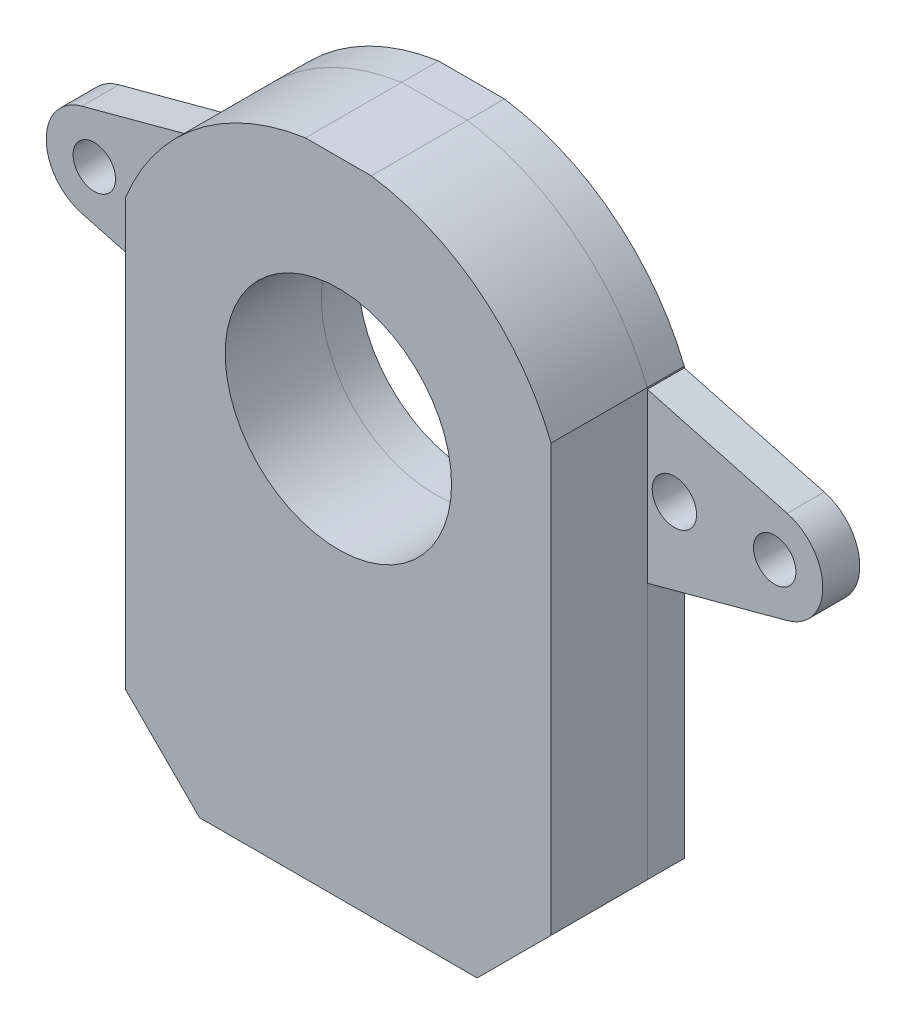
ISO-10303-21;
HEADER;
FILE_DESCRIPTION(('STEP AP214'),'2;1');
FILE_NAME('part.step','',(''),(''),'','','');
FILE_SCHEMA(('AUTOMOTIVE_DESIGN { 1 0 10303 214 1 1 1 1 }'));
ENDSEC;
DATA;
#1=APPLICATION_CONTEXT('core data for automotive mechanical design processes');
#2=APPLICATION_PROTOCOL_DEFINITION('international standard','automotive_design',2000,#1);
#3=PRODUCT_CONTEXT('',#1,'mechanical');
#4=PRODUCT('Part','Part','',(#3));
#5=PRODUCT_RELATED_PRODUCT_CATEGORY('part','',(#4));
#6=PRODUCT_DEFINITION_FORMATION('','',#4);
#7=PRODUCT_DEFINITION_CONTEXT('part definition',#1,'design');
#8=PRODUCT_DEFINITION('design','',#6,#7);
#9=PRODUCT_DEFINITION_SHAPE('','',#8);
#10=(LENGTH_UNIT() NAMED_UNIT(*) SI_UNIT(.MILLI.,.METRE.));
#11=(NAMED_UNIT(*) PLANE_ANGLE_UNIT() SI_UNIT($,.RADIAN.));
#12=(NAMED_UNIT(*) SI_UNIT($,.STERADIAN.) SOLID_ANGLE_UNIT());
#13=UNCERTAINTY_MEASURE_WITH_UNIT(LENGTH_MEASURE(1.E-05),#10,'distance_accuracy_value','');
#14=(GEOMETRIC_REPRESENTATION_CONTEXT(3) GLOBAL_UNCERTAINTY_ASSIGNED_CONTEXT((#13)) GLOBAL_UNIT_ASSIGNED_CONTEXT((#10,
#11,#12)) REPRESENTATION_CONTEXT('',''));
#15=CARTESIAN_POINT('',(0.,0.,0.));
#16=DIRECTION('',(0.,0.,1.));
#17=DIRECTION('',(1.,0.,0.));
#18=AXIS2_PLACEMENT_3D('',#15,#16,#17);
#19=CARTESIAN_POINT('',(0.,0.,9.));
#20=DIRECTION('',(0.,0.,1.));
#21=DIRECTION('',(1.,0.,0.));
#22=AXIS2_PLACEMENT_3D('',#19,#20,#21);
#23=PLANE('',#22);
#24=CARTESIAN_POINT('',(0.,0.,9.));
#25=DIRECTION('',(0.,0.,1.));
#26=DIRECTION('',(1.,0.,0.));
#27=AXIS2_PLACEMENT_3D('',#24,#25,#26);
#28=CIRCLE('',#27,7.65);
#29=CARTESIAN_POINT('',(7.65,0.,9.));
#30=VERTEX_POINT('',#29);
#31=EDGE_CURVE('E161',#30,#30,#28,.T.);
#32=ORIENTED_EDGE('',*,*,#31,.F.);
#33=EDGE_LOOP('',(#32));
#34=FACE_BOUND('',#33,.T.);
#35=DIRECTION('',(-1.,0.,0.));
#36=VECTOR('',#35,1.);
#37=CARTESIAN_POINT('',(0.,-28.04,9.));
#38=LINE('',#37,#36);
#39=CARTESIAN_POINT('',(9.38499999999999,-28.04,9.));
#40=VERTEX_POINT('',#39);
#41=CARTESIAN_POINT('',(-9.38499999999999,-28.04,9.));
#42=VERTEX_POINT('',#41);
#43=EDGE_CURVE('E148',#40,#42,#38,.T.);
#44=ORIENTED_EDGE('',*,*,#43,.F.);
#45=DIRECTION('',(-0.707106781186549,-0.707106781186546,0.));
#46=VECTOR('',#45,1.);
#47=CARTESIAN_POINT('',(18.7125,-18.7125000000001,9.));
#48=LINE('',#47,#46);
#49=CARTESIAN_POINT('',(14.385,-23.04,9.));
#50=VERTEX_POINT('',#49);
#51=EDGE_CURVE('E55',#40,#50,#48,.F.);
#52=ORIENTED_EDGE('',*,*,#51,.T.);
#53=DIRECTION('',(0.,-1.,0.));
#54=VECTOR('',#53,1.);
#55=CARTESIAN_POINT('',(14.385,0.,9.));
#56=LINE('',#55,#54);
#57=CARTESIAN_POINT('',(14.385,5.77250162407946,9.));
#58=VERTEX_POINT('',#57);
#59=EDGE_CURVE('E128',#58,#50,#56,.T.);
#60=ORIENTED_EDGE('',*,*,#59,.F.);
#61=CARTESIAN_POINT('',(0.,0.,9.));
#62=DIRECTION('',(0.,0.,1.));
#63=DIRECTION('',(1.,0.,0.));
#64=AXIS2_PLACEMENT_3D('',#61,#62,#63);
#65=CIRCLE('',#64,15.5);
#66=CARTESIAN_POINT('',(2.22135094030637,15.34,9.));
#67=VERTEX_POINT('',#66);
#68=EDGE_CURVE('E111',#58,#67,#65,.T.);
#69=ORIENTED_EDGE('',*,*,#68,.T.);
#70=DIRECTION('',(1.,0.,0.));
#71=VECTOR('',#70,1.);
#72=CARTESIAN_POINT('',(0.,15.34,9.));
#73=LINE('',#72,#71);
#74=CARTESIAN_POINT('',(-2.22135094030637,15.34,9.));
#75=VERTEX_POINT('',#74);
#76=EDGE_CURVE('E135',#75,#67,#73,.T.);
#77=ORIENTED_EDGE('',*,*,#76,.F.);
#78=CARTESIAN_POINT('',(-14.385,5.77250162407947,9.));
#79=VERTEX_POINT('',#78);
#80=EDGE_CURVE('E121',#75,#79,#65,.T.);
#81=ORIENTED_EDGE('',*,*,#80,.T.);
#82=DIRECTION('',(0.,1.,0.));
#83=VECTOR('',#82,1.);
#84=CARTESIAN_POINT('',(-14.385,0.,9.));
#85=LINE('',#84,#83);
#86=CARTESIAN_POINT('',(-14.385,-23.04,9.));
#87=VERTEX_POINT('',#86);
#88=EDGE_CURVE('E138',#87,#79,#85,.T.);
#89=ORIENTED_EDGE('',*,*,#88,.F.);
#90=DIRECTION('',(-0.707106781186546,0.707106781186549,0.));
#91=VECTOR('',#90,1.);
#92=CARTESIAN_POINT('',(-18.7125,-18.7124999999999,9.));
#93=LINE('',#92,#91);
#94=EDGE_CURVE('E67',#87,#42,#93,.F.);
#95=ORIENTED_EDGE('',*,*,#94,.T.);
#96=EDGE_LOOP('',(#44,#52,#60,#69,#77,#81,#89,#95));
#97=FACE_BOUND('',#96,.T.);
#98=ADVANCED_FACE('F47',(#34,#97),#23,.T.);
#99=CARTESIAN_POINT('',(0.,0.,2.5));
#100=DIRECTION('',(0.,0.,1.));
#101=DIRECTION('',(1.,0.,0.));
#102=AXIS2_PLACEMENT_3D('',#99,#100,#101);
#103=PLANE('',#102);
#104=CARTESIAN_POINT('',(0.,0.,2.5));
#105=DIRECTION('',(0.,0.,1.));
#106=DIRECTION('',(1.,0.,0.));
#107=AXIS2_PLACEMENT_3D('',#104,#105,#106);
#108=CIRCLE('',#107,7.65);
#109=CARTESIAN_POINT('',(7.65,0.,2.5));
#110=VERTEX_POINT('',#109);
#111=EDGE_CURVE('E158',#110,#110,#108,.F.);
#112=ORIENTED_EDGE('',*,*,#111,.F.);
#113=EDGE_LOOP('',(#112));
#114=FACE_BOUND('',#113,.T.);
#115=DIRECTION('',(0.,-1.,0.));
#116=VECTOR('',#115,1.);
#117=CARTESIAN_POINT('',(14.385,0.,2.5));
#118=LINE('',#117,#116);
#119=CARTESIAN_POINT('',(14.385,5.77250162407946,2.5));
#120=VERTEX_POINT('',#119);
#121=CARTESIAN_POINT('',(14.385,-23.04,2.5));
#122=VERTEX_POINT('',#121);
#123=EDGE_CURVE('E131',#120,#122,#118,.T.);
#124=ORIENTED_EDGE('',*,*,#123,.T.);
#125=DIRECTION('',(0.707106781186549,0.707106781186546,0.));
#126=VECTOR('',#125,1.);
#127=CARTESIAN_POINT('',(14.385,-23.04,2.5));
#128=LINE('',#127,#126);
#129=CARTESIAN_POINT('',(9.38499999999999,-28.04,2.5));
#130=VERTEX_POINT('',#129);
#131=EDGE_CURVE('E166',#122,#130,#128,.F.);
#132=ORIENTED_EDGE('',*,*,#131,.T.);
#133=DIRECTION('',(-1.,0.,0.));
#134=VECTOR('',#133,1.);
#135=CARTESIAN_POINT('',(0.,-28.04,2.5));
#136=LINE('',#135,#134);
#137=CARTESIAN_POINT('',(-9.38499999999999,-28.04,2.5));
#138=VERTEX_POINT('',#137);
#139=EDGE_CURVE('E136',#130,#138,#136,.T.);
#140=ORIENTED_EDGE('',*,*,#139,.T.);
#141=DIRECTION('',(0.707106781186546,-0.707106781186549,0.));
#142=VECTOR('',#141,1.);
#143=CARTESIAN_POINT('',(-9.38499999999999,-28.04,2.5));
#144=LINE('',#143,#142);
#145=CARTESIAN_POINT('',(-14.385,-23.04,2.5));
#146=VERTEX_POINT('',#145);
#147=EDGE_CURVE('E164',#138,#146,#144,.F.);
#148=ORIENTED_EDGE('',*,*,#147,.T.);
#149=DIRECTION('',(0.,1.,0.));
#150=VECTOR('',#149,1.);
#151=CARTESIAN_POINT('',(-14.385,0.,2.5));
#152=LINE('',#151,#150);
#153=CARTESIAN_POINT('',(-14.385,5.77250162407947,2.5));
#154=VERTEX_POINT('',#153);
#155=EDGE_CURVE('E141',#146,#154,#152,.T.);
#156=ORIENTED_EDGE('',*,*,#155,.T.);
#157=CARTESIAN_POINT('',(0.,0.,2.5));
#158=DIRECTION('',(0.,0.,1.));
#159=DIRECTION('',(1.,0.,0.));
#160=AXIS2_PLACEMENT_3D('',#157,#158,#159);
#161=CIRCLE('',#160,15.5);
#162=CARTESIAN_POINT('',(-2.22135094030637,15.34,2.5));
#163=VERTEX_POINT('',#162);
#164=EDGE_CURVE('E157',#154,#163,#161,.F.);
#165=ORIENTED_EDGE('',*,*,#164,.T.);
#166=DIRECTION('',(1.,0.,0.));
#167=VECTOR('',#166,1.);
#168=CARTESIAN_POINT('',(0.,15.34,2.5));
#169=LINE('',#168,#167);
#170=CARTESIAN_POINT('',(2.22135094030637,15.34,2.5));
#171=VERTEX_POINT('',#170);
#172=EDGE_CURVE('E152',#163,#171,#169,.T.);
#173=ORIENTED_EDGE('',*,*,#172,.T.);
#174=EDGE_CURVE('E150',#171,#120,#161,.F.);
#175=ORIENTED_EDGE('',*,*,#174,.T.);
#176=EDGE_LOOP('',(#124,#132,#140,#148,#156,#165,#173,#175));
#177=FACE_BOUND('',#176,.T.);
#178=ADVANCED_FACE('F181',(#114,#177),#103,.F.);
#179=CARTESIAN_POINT('',(14.385,0.,9.));
#180=DIRECTION('',(1.,0.,0.));
#181=DIRECTION('',(0.,1.,0.));
#182=AXIS2_PLACEMENT_3D('',#179,#180,#181);
#183=PLANE('',#182);
#184=ORIENTED_EDGE('',*,*,#59,.T.);
#185=DIRECTION('',(0.,0.,-1.));
#186=VECTOR('',#185,1.);
#187=CARTESIAN_POINT('',(14.385,-23.04,9.));
#188=LINE('',#187,#186);
#189=EDGE_CURVE('E162',#50,#122,#188,.T.);
#190=ORIENTED_EDGE('',*,*,#189,.T.);
#191=ORIENTED_EDGE('',*,*,#123,.F.);
#192=DIRECTION('',(0.,0.,-1.));
#193=VECTOR('',#192,1.);
#194=CARTESIAN_POINT('',(14.385,5.77250162407946,9.));
#195=LINE('',#194,#193);
#196=EDGE_CURVE('E114',#58,#120,#195,.T.);
#197=ORIENTED_EDGE('',*,*,#196,.F.);
#198=EDGE_LOOP('',(#184,#190,#191,#197));
#199=FACE_BOUND('',#198,.T.);
#200=ADVANCED_FACE('F126',(#199),#183,.T.);
#201=CARTESIAN_POINT('',(0.,15.34,9.));
#202=DIRECTION('',(0.,1.,0.));
#203=DIRECTION('',(0.,0.,1.));
#204=AXIS2_PLACEMENT_3D('',#201,#202,#203);
#205=PLANE('',#204);
#206=DIRECTION('',(0.,0.,-1.));
#207=VECTOR('',#206,1.);
#208=CARTESIAN_POINT('',(2.2213509403064,15.34,9.));
#209=LINE('',#208,#207);
#210=EDGE_CURVE('E117',#171,#67,#209,.F.);
#211=ORIENTED_EDGE('',*,*,#210,.F.);
#212=ORIENTED_EDGE('',*,*,#172,.F.);
#213=DIRECTION('',(0.,0.,-1.));
#214=VECTOR('',#213,1.);
#215=CARTESIAN_POINT('',(-2.2213509403064,15.34,9.));
#216=LINE('',#215,#214);
#217=EDGE_CURVE('E144',#75,#163,#216,.T.);
#218=ORIENTED_EDGE('',*,*,#217,.F.);
#219=ORIENTED_EDGE('',*,*,#76,.T.);
#220=EDGE_LOOP('',(#211,#212,#218,#219));
#221=FACE_BOUND('',#220,.T.);
#222=ADVANCED_FACE('F185',(#221),#205,.T.);
#223=CARTESIAN_POINT('',(-14.385,0.,9.));
#224=DIRECTION('',(-1.,0.,0.));
#225=DIRECTION('',(0.,0.,1.));
#226=AXIS2_PLACEMENT_3D('',#223,#224,#225);
#227=PLANE('',#226);
#228=ORIENTED_EDGE('',*,*,#155,.F.);
#229=DIRECTION('',(0.,0.,1.));
#230=VECTOR('',#229,1.);
#231=CARTESIAN_POINT('',(-14.385,-23.04,9.));
#232=LINE('',#231,#230);
#233=EDGE_CURVE('E12',#146,#87,#232,.T.);
#234=ORIENTED_EDGE('',*,*,#233,.T.);
#235=ORIENTED_EDGE('',*,*,#88,.T.);
#236=DIRECTION('',(0.,0.,-1.));
#237=VECTOR('',#236,1.);
#238=CARTESIAN_POINT('',(-14.385,5.77250162407948,9.));
#239=LINE('',#238,#237);
#240=EDGE_CURVE('E132',#154,#79,#239,.F.);
#241=ORIENTED_EDGE('',*,*,#240,.F.);
#242=EDGE_LOOP('',(#228,#234,#235,#241));
#243=FACE_BOUND('',#242,.T.);
#244=ADVANCED_FACE('F195',(#243),#227,.T.);
#245=CARTESIAN_POINT('',(0.,-28.04,9.));
#246=DIRECTION('',(0.,-1.,0.));
#247=DIRECTION('',(1.,0.,0.));
#248=AXIS2_PLACEMENT_3D('',#245,#246,#247);
#249=PLANE('',#248);
#250=ORIENTED_EDGE('',*,*,#139,.F.);
#251=DIRECTION('',(0.,0.,1.));
#252=VECTOR('',#251,1.);
#253=CARTESIAN_POINT('',(9.38499999999999,-28.04,9.));
#254=LINE('',#253,#252);
#255=EDGE_CURVE('E171',#130,#40,#254,.T.);
#256=ORIENTED_EDGE('',*,*,#255,.T.);
#257=ORIENTED_EDGE('',*,*,#43,.T.);
#258=DIRECTION('',(0.,0.,-1.));
#259=VECTOR('',#258,1.);
#260=CARTESIAN_POINT('',(-9.38499999999999,-28.04,9.));
#261=LINE('',#260,#259);
#262=EDGE_CURVE('E168',#42,#138,#261,.T.);
#263=ORIENTED_EDGE('',*,*,#262,.T.);
#264=EDGE_LOOP('',(#250,#256,#257,#263));
#265=FACE_BOUND('',#264,.T.);
#266=ADVANCED_FACE('F176',(#265),#249,.T.);
#267=CARTESIAN_POINT('',(0.,0.,9.));
#268=DIRECTION('',(0.,0.,-1.));
#269=DIRECTION('',(-1.,0.,0.));
#270=AXIS2_PLACEMENT_3D('',#267,#268,#269);
#271=CYLINDRICAL_SURFACE('',#270,15.5);
#272=ORIENTED_EDGE('',*,*,#196,.T.);
#273=ORIENTED_EDGE('',*,*,#174,.F.);
#274=ORIENTED_EDGE('',*,*,#210,.T.);
#275=ORIENTED_EDGE('',*,*,#68,.F.);
#276=EDGE_LOOP('',(#272,#273,#274,#275));
#277=FACE_BOUND('',#276,.T.);
#278=ADVANCED_FACE('F113',(#277),#271,.T.);
#279=ORIENTED_EDGE('',*,*,#217,.T.);
#280=ORIENTED_EDGE('',*,*,#164,.F.);
#281=ORIENTED_EDGE('',*,*,#240,.T.);
#282=ORIENTED_EDGE('',*,*,#80,.F.);
#283=EDGE_LOOP('',(#279,#280,#281,#282));
#284=FACE_BOUND('',#283,.T.);
#285=ADVANCED_FACE('F194',(#284),#271,.T.);
#286=CARTESIAN_POINT('',(0.,0.,9.));
#287=DIRECTION('',(0.,0.,-1.));
#288=DIRECTION('',(-1.,0.,0.));
#289=AXIS2_PLACEMENT_3D('',#286,#287,#288);
#290=CYLINDRICAL_SURFACE('',#289,7.65);
#291=ORIENTED_EDGE('',*,*,#31,.T.);
#292=EDGE_LOOP('',(#291));
#293=FACE_BOUND('',#292,.T.);
#294=ORIENTED_EDGE('',*,*,#111,.T.);
#295=EDGE_LOOP('',(#294));
#296=FACE_BOUND('',#295,.T.);
#297=ADVANCED_FACE('F201',(#293,#296),#290,.F.);
#298=CARTESIAN_POINT('',(14.385,-23.04,9.));
#299=DIRECTION('',(-0.707106781186546,0.707106781186549,0.));
#300=DIRECTION('',(0.,0.,-1.));
#301=AXIS2_PLACEMENT_3D('',#298,#299,#300);
#302=PLANE('',#301);
#303=ORIENTED_EDGE('',*,*,#51,.F.);
#304=ORIENTED_EDGE('',*,*,#255,.F.);
#305=ORIENTED_EDGE('',*,*,#131,.F.);
#306=ORIENTED_EDGE('',*,*,#189,.F.);
#307=EDGE_LOOP('',(#303,#304,#305,#306));
#308=FACE_BOUND('',#307,.T.);
#309=ADVANCED_FACE('F179',(#308),#302,.F.);
#310=CARTESIAN_POINT('',(-9.38499999999999,-28.04,9.));
#311=DIRECTION('',(0.707106781186549,0.707106781186546,0.));
#312=DIRECTION('',(0.,0.,-1.));
#313=AXIS2_PLACEMENT_3D('',#310,#311,#312);
#314=PLANE('',#313);
#315=ORIENTED_EDGE('',*,*,#94,.F.);
#316=ORIENTED_EDGE('',*,*,#233,.F.);
#317=ORIENTED_EDGE('',*,*,#147,.F.);
#318=ORIENTED_EDGE('',*,*,#262,.F.);
#319=EDGE_LOOP('',(#315,#316,#317,#318));
#320=FACE_BOUND('',#319,.T.);
#321=ADVANCED_FACE('F49',(#320),#314,.F.);
#322=CLOSED_SHELL('',(#98,#178,#200,#222,#244,#266,#278,#285,#297,#309,#321));
#323=MANIFOLD_SOLID_BREP('B2',#322);
#324=CARTESIAN_POINT('',(14.385,0.,2.5));
#325=DIRECTION('',(1.,0.,0.));
#326=DIRECTION('',(0.,1.,0.));
#327=AXIS2_PLACEMENT_3D('',#324,#325,#326);
#328=PLANE('',#327);
#329=DIRECTION('',(0.,-1.,0.));
#330=VECTOR('',#329,1.);
#331=CARTESIAN_POINT('',(14.385,0.,2.5));
#332=LINE('',#331,#330);
#333=CARTESIAN_POINT('',(14.385,5.77250162407946,2.5));
#334=VERTEX_POINT('',#333);
#335=CARTESIAN_POINT('',(14.385,5.67477640684251,2.5));
#336=VERTEX_POINT('',#335);
#337=EDGE_CURVE('E506',#334,#336,#332,.T.);
#338=ORIENTED_EDGE('',*,*,#337,.T.);
#339=DIRECTION('',(0.,0.,-1.));
#340=VECTOR('',#339,1.);
#341=CARTESIAN_POINT('',(14.385,5.67477640684251,2.5));
#342=LINE('',#341,#340);
#343=CARTESIAN_POINT('',(14.385,5.67477640684251,0.));
#344=VERTEX_POINT('',#343);
#345=EDGE_CURVE('E426',#336,#344,#342,.T.);
#346=ORIENTED_EDGE('',*,*,#345,.T.);
#347=DIRECTION('',(0.,-1.,0.));
#348=VECTOR('',#347,1.);
#349=CARTESIAN_POINT('',(14.385,0.,0.));
#350=LINE('',#349,#348);
#351=CARTESIAN_POINT('',(14.385,5.77250162407946,0.));
#352=VERTEX_POINT('',#351);
#353=EDGE_CURVE('E518',#352,#344,#350,.T.);
#354=ORIENTED_EDGE('',*,*,#353,.F.);
#355=DIRECTION('',(0.,0.,-1.));
#356=VECTOR('',#355,1.);
#357=CARTESIAN_POINT('',(14.385,5.77250162407946,9.));
#358=LINE('',#357,#356);
#359=EDGE_CURVE('E498',#334,#352,#358,.T.);
#360=ORIENTED_EDGE('',*,*,#359,.F.);
#361=EDGE_LOOP('',(#338,#346,#354,#360));
#362=FACE_BOUND('',#361,.T.);
#363=ADVANCED_FACE('F296',(#362),#328,.T.);
#364=CARTESIAN_POINT('',(-14.385,0.,2.5));
#365=DIRECTION('',(-1.,0.,0.));
#366=DIRECTION('',(0.,0.,1.));
#367=AXIS2_PLACEMENT_3D('',#364,#365,#366);
#368=PLANE('',#367);
#369=DIRECTION('',(0.,1.,0.));
#370=VECTOR('',#369,1.);
#371=CARTESIAN_POINT('',(-14.385,0.,0.));
#372=LINE('',#371,#370);
#373=CARTESIAN_POINT('',(-14.385,-23.04,0.));
#374=VERTEX_POINT('',#373);
#375=CARTESIAN_POINT('',(-14.385,-5.67477640683656,0.));
#376=VERTEX_POINT('',#375);
#377=EDGE_CURVE('E525',#374,#376,#372,.T.);
#378=ORIENTED_EDGE('',*,*,#377,.F.);
#379=DIRECTION('',(0.,0.,1.));
#380=VECTOR('',#379,1.);
#381=CARTESIAN_POINT('',(-14.385,-23.04,2.5));
#382=LINE('',#381,#380);
#383=CARTESIAN_POINT('',(-14.385,-23.04,2.5));
#384=VERTEX_POINT('',#383);
#385=EDGE_CURVE('E45',#374,#384,#382,.T.);
#386=ORIENTED_EDGE('',*,*,#385,.T.);
#387=DIRECTION('',(0.,1.,0.));
#388=VECTOR('',#387,1.);
#389=CARTESIAN_POINT('',(-14.385,0.,2.5));
#390=LINE('',#389,#388);
#391=CARTESIAN_POINT('',(-14.385,-5.67477640683656,2.5));
#392=VERTEX_POINT('',#391);
#393=EDGE_CURVE('E513',#384,#392,#390,.T.);
#394=ORIENTED_EDGE('',*,*,#393,.T.);
#395=DIRECTION('',(0.,0.,-1.));
#396=VECTOR('',#395,1.);
#397=CARTESIAN_POINT('',(-14.385,-5.67477640683656,2.5));
#398=LINE('',#397,#396);
#399=EDGE_CURVE('E536',#392,#376,#398,.T.);
#400=ORIENTED_EDGE('',*,*,#399,.T.);
#401=EDGE_LOOP('',(#378,#386,#394,#400));
#402=FACE_BOUND('',#401,.T.);
#403=ADVANCED_FACE('F574',(#402),#368,.T.);
#404=CARTESIAN_POINT('',(0.,0.,2.5));
#405=DIRECTION('',(0.,0.,1.));
#406=DIRECTION('',(1.,0.,0.));
#407=AXIS2_PLACEMENT_3D('',#404,#405,#406);
#408=PLANE('',#407);
#409=DIRECTION('',(-1.,0.,0.));
#410=VECTOR('',#409,1.);
#411=CARTESIAN_POINT('',(0.,-28.04,2.5));
#412=LINE('',#411,#410);
#413=CARTESIAN_POINT('',(9.385,-28.04,2.5));
#414=VERTEX_POINT('',#413);
#415=CARTESIAN_POINT('',(-9.38500000000001,-28.04,2.5));
#416=VERTEX_POINT('',#415);
#417=EDGE_CURVE('E515',#414,#416,#412,.T.);
#418=ORIENTED_EDGE('',*,*,#417,.F.);
#419=DIRECTION('',(-0.707106781186549,-0.707106781186546,0.));
#420=VECTOR('',#419,1.);
#421=CARTESIAN_POINT('',(18.7125,-18.7125000000001,2.5));
#422=LINE('',#421,#420);
#423=CARTESIAN_POINT('',(14.385,-23.04,2.5));
#424=VERTEX_POINT('',#423);
#425=EDGE_CURVE('E304',#414,#424,#422,.F.);
#426=ORIENTED_EDGE('',*,*,#425,.T.);
#427=CARTESIAN_POINT('',(14.385,-5.67477640683656,2.5));
#428=VERTEX_POINT('',#427);
#429=EDGE_CURVE('E509',#428,#424,#332,.T.);
#430=ORIENTED_EDGE('',*,*,#429,.F.);
#431=DIRECTION('',(-0.965925826289123,-0.258819045102317,0.));
#432=VECTOR('',#431,1.);
#433=CARTESIAN_POINT('',(2.38230638498701,-8.89088846797477,2.5));
#434=LINE('',#433,#432);
#435=CARTESIAN_POINT('',(23.8394748803594,-3.14145749778608,2.5));
#436=VERTEX_POINT('',#435);
#437=EDGE_CURVE('E429',#436,#428,#434,.T.);
#438=ORIENTED_EDGE('',*,*,#437,.F.);
#439=CARTESIAN_POINT('',(22.9977238807716,0.,2.5));
#440=DIRECTION('',(0.,0.,-1.));
#441=DIRECTION('',(-1.,0.,0.));
#442=AXIS2_PLACEMENT_3D('',#439,#440,#441);
#443=CIRCLE('',#442,3.2522761192284);
#444=CARTESIAN_POINT('',(23.8394748803612,3.14145749778558,2.5));
#445=VERTEX_POINT('',#444);
#446=EDGE_CURVE('E413',#445,#436,#443,.T.);
#447=ORIENTED_EDGE('',*,*,#446,.F.);
#448=DIRECTION('',(-0.965925826288971,0.258819045102884,0.));
#449=VECTOR('',#448,1.);
#450=CARTESIAN_POINT('',(2.3823063849956,8.89088846798596,2.5));
#451=LINE('',#450,#449);
#452=EDGE_CURVE('E423',#445,#336,#451,.T.);
#453=ORIENTED_EDGE('',*,*,#452,.T.);
#454=ORIENTED_EDGE('',*,*,#337,.F.);
#455=CARTESIAN_POINT('',(0.,0.,2.5));
#456=DIRECTION('',(0.,0.,1.));
#457=DIRECTION('',(1.,0.,0.));
#458=AXIS2_PLACEMENT_3D('',#455,#456,#457);
#459=CIRCLE('',#458,15.5);
#460=CARTESIAN_POINT('',(2.22135094030637,15.34,2.5));
#461=VERTEX_POINT('',#460);
#462=EDGE_CURVE('E493',#461,#334,#459,.F.);
#463=ORIENTED_EDGE('',*,*,#462,.F.);
#464=DIRECTION('',(1.,0.,0.));
#465=VECTOR('',#464,1.);
#466=CARTESIAN_POINT('',(0.,15.34,2.5));
#467=LINE('',#466,#465);
#468=CARTESIAN_POINT('',(-2.22135094030637,15.34,2.5));
#469=VERTEX_POINT('',#468);
#470=EDGE_CURVE('E508',#469,#461,#467,.T.);
#471=ORIENTED_EDGE('',*,*,#470,.F.);
#472=CARTESIAN_POINT('',(-14.385,5.77250162407947,2.5));
#473=VERTEX_POINT('',#472);
#474=EDGE_CURVE('E496',#473,#469,#459,.F.);
#475=ORIENTED_EDGE('',*,*,#474,.F.);
#476=CARTESIAN_POINT('',(-14.385,5.67477640684251,2.5));
#477=VERTEX_POINT('',#476);
#478=EDGE_CURVE('E512',#477,#473,#390,.T.);
#479=ORIENTED_EDGE('',*,*,#478,.F.);
#480=DIRECTION('',(0.965925826288971,0.258819045102884,0.));
#481=VECTOR('',#480,1.);
#482=CARTESIAN_POINT('',(-2.3823063849956,8.89088846798596,2.5));
#483=LINE('',#482,#481);
#484=CARTESIAN_POINT('',(-23.8394748803612,3.14145749778558,2.5));
#485=VERTEX_POINT('',#484);
#486=EDGE_CURVE('E465',#485,#477,#483,.T.);
#487=ORIENTED_EDGE('',*,*,#486,.F.);
#488=CARTESIAN_POINT('',(-22.9977238807716,0.,2.5));
#489=DIRECTION('',(0.,0.,1.));
#490=DIRECTION('',(1.,0.,0.));
#491=AXIS2_PLACEMENT_3D('',#488,#489,#490);
#492=CIRCLE('',#491,3.2522761192284);
#493=CARTESIAN_POINT('',(-23.8394748803594,-3.14145749778608,2.5));
#494=VERTEX_POINT('',#493);
#495=EDGE_CURVE('E458',#485,#494,#492,.T.);
#496=ORIENTED_EDGE('',*,*,#495,.T.);
#497=DIRECTION('',(0.965925826289123,-0.258819045102317,0.));
#498=VECTOR('',#497,1.);
#499=CARTESIAN_POINT('',(-2.38230638498701,-8.89088846797477,2.5));
#500=LINE('',#499,#498);
#501=EDGE_CURVE('E462',#494,#392,#500,.T.);
#502=ORIENTED_EDGE('',*,*,#501,.T.);
#503=ORIENTED_EDGE('',*,*,#393,.F.);
#504=DIRECTION('',(-0.707106781186546,0.707106781186549,0.));
#505=VECTOR('',#504,1.);
#506=CARTESIAN_POINT('',(-18.7125,-18.7124999999999,2.5));
#507=LINE('',#506,#505);
#508=EDGE_CURVE('E316',#384,#416,#507,.F.);
#509=ORIENTED_EDGE('',*,*,#508,.T.);
#510=EDGE_LOOP('',(#418,#426,#430,#438,#447,#453,#454,#463,#471,#475,#479,#487,#496,#502,#503,#509));
#511=FACE_BOUND('',#510,.T.);
#512=CARTESIAN_POINT('',(0.,0.,2.5));
#513=DIRECTION('',(0.,0.,1.));
#514=DIRECTION('',(1.,0.,0.));
#515=AXIS2_PLACEMENT_3D('',#512,#513,#514);
#516=CIRCLE('',#515,7.65);
#517=CARTESIAN_POINT('',(7.65,0.,2.5));
#518=VERTEX_POINT('',#517);
#519=EDGE_CURVE('E490',#518,#518,#516,.F.);
#520=ORIENTED_EDGE('',*,*,#519,.T.);
#521=EDGE_LOOP('',(#520));
#522=FACE_BOUND('',#521,.T.);
#523=CARTESIAN_POINT('',(22.9977238807716,0.,2.5));
#524=DIRECTION('',(0.,0.,-1.));
#525=DIRECTION('',(-1.,0.,0.));
#526=AXIS2_PLACEMENT_3D('',#523,#524,#525);
#527=CIRCLE('',#526,1.435);
#528=CARTESIAN_POINT('',(21.5627238807716,0.,2.5));
#529=VERTEX_POINT('',#528);
#530=EDGE_CURVE('E434',#529,#529,#527,.T.);
#531=ORIENTED_EDGE('',*,*,#530,.T.);
#532=EDGE_LOOP('',(#531));
#533=FACE_BOUND('',#532,.T.);
#534=CARTESIAN_POINT('',(16.215,0.,2.5));
#535=DIRECTION('',(0.,0.,-1.));
#536=DIRECTION('',(-1.,0.,0.));
#537=AXIS2_PLACEMENT_3D('',#534,#535,#536);
#538=CIRCLE('',#537,1.5);
#539=CARTESIAN_POINT('',(14.715,0.,2.5));
#540=VERTEX_POINT('',#539);
#541=EDGE_CURVE('E441',#540,#540,#538,.T.);
#542=ORIENTED_EDGE('',*,*,#541,.T.);
#543=EDGE_LOOP('',(#542));
#544=FACE_BOUND('',#543,.T.);
#545=CARTESIAN_POINT('',(-22.9977238807716,0.,2.5));
#546=DIRECTION('',(0.,0.,1.));
#547=DIRECTION('',(1.,0.,0.));
#548=AXIS2_PLACEMENT_3D('',#545,#546,#547);
#549=CIRCLE('',#548,1.435);
#550=CARTESIAN_POINT('',(-21.5627238807716,0.,2.5));
#551=VERTEX_POINT('',#550);
#552=EDGE_CURVE('E455',#551,#551,#549,.T.);
#553=ORIENTED_EDGE('',*,*,#552,.F.);
#554=EDGE_LOOP('',(#553));
#555=FACE_BOUND('',#554,.T.);
#556=CARTESIAN_POINT('',(-16.215,0.,2.5));
#557=DIRECTION('',(0.,0.,1.));
#558=DIRECTION('',(1.,0.,0.));
#559=AXIS2_PLACEMENT_3D('',#556,#557,#558);
#560=CIRCLE('',#559,1.5);
#561=CARTESIAN_POINT('',(-14.715,0.,2.5));
#562=VERTEX_POINT('',#561);
#563=EDGE_CURVE('E467',#562,#562,#560,.T.);
#564=ORIENTED_EDGE('',*,*,#563,.F.);
#565=EDGE_LOOP('',(#564));
#566=FACE_BOUND('',#565,.T.);
#567=ADVANCED_FACE('F431',(#511,#522,#533,#544,#555,#566),#408,.T.);
#568=CARTESIAN_POINT('',(0.,0.,0.));
#569=DIRECTION('',(0.,0.,1.));
#570=DIRECTION('',(1.,0.,0.));
#571=AXIS2_PLACEMENT_3D('',#568,#569,#570);
#572=PLANE('',#571);
#573=CARTESIAN_POINT('',(14.385,-5.67477640683656,0.));
#574=VERTEX_POINT('',#573);
#575=CARTESIAN_POINT('',(14.385,-23.04,0.));
#576=VERTEX_POINT('',#575);
#577=EDGE_CURVE('E505',#574,#576,#350,.T.);
#578=ORIENTED_EDGE('',*,*,#577,.T.);
#579=DIRECTION('',(0.707106781186549,0.707106781186546,0.));
#580=VECTOR('',#579,1.);
#581=CARTESIAN_POINT('',(14.385,-23.04,0.));
#582=LINE('',#581,#580);
#583=CARTESIAN_POINT('',(9.385,-28.04,0.));
#584=VERTEX_POINT('',#583);
#585=EDGE_CURVE('E548',#576,#584,#582,.F.);
#586=ORIENTED_EDGE('',*,*,#585,.T.);
#587=DIRECTION('',(-1.,0.,0.));
#588=VECTOR('',#587,1.);
#589=CARTESIAN_POINT('',(0.,-28.04,0.));
#590=LINE('',#589,#588);
#591=CARTESIAN_POINT('',(-9.38500000000001,-28.04,0.));
#592=VERTEX_POINT('',#591);
#593=EDGE_CURVE('E527',#584,#592,#590,.T.);
#594=ORIENTED_EDGE('',*,*,#593,.T.);
#595=DIRECTION('',(0.707106781186546,-0.707106781186549,0.));
#596=VECTOR('',#595,1.);
#597=CARTESIAN_POINT('',(-9.38500000000001,-28.04,0.));
#598=LINE('',#597,#596);
#599=EDGE_CURVE('E546',#592,#374,#598,.F.);
#600=ORIENTED_EDGE('',*,*,#599,.T.);
#601=ORIENTED_EDGE('',*,*,#377,.T.);
#602=DIRECTION('',(0.965925826289123,-0.258819045102317,0.));
#603=VECTOR('',#602,1.);
#604=CARTESIAN_POINT('',(-2.38230638498701,-8.89088846797477,0.));
#605=LINE('',#604,#603);
#606=CARTESIAN_POINT('',(-23.8394748803594,-3.14145749778608,0.));
#607=VERTEX_POINT('',#606);
#608=EDGE_CURVE('E476',#607,#376,#605,.T.);
#609=ORIENTED_EDGE('',*,*,#608,.F.);
#610=CARTESIAN_POINT('',(-22.9977238807716,0.,0.));
#611=DIRECTION('',(0.,0.,1.));
#612=DIRECTION('',(1.,0.,0.));
#613=AXIS2_PLACEMENT_3D('',#610,#611,#612);
#614=CIRCLE('',#613,3.2522761192284);
#615=CARTESIAN_POINT('',(-23.8394748803612,3.14145749778558,0.));
#616=VERTEX_POINT('',#615);
#617=EDGE_CURVE('E473',#616,#607,#614,.T.);
#618=ORIENTED_EDGE('',*,*,#617,.F.);
#619=DIRECTION('',(0.965925826288971,0.258819045102884,0.));
#620=VECTOR('',#619,1.);
#621=CARTESIAN_POINT('',(-2.3823063849956,8.89088846798596,0.));
#622=LINE('',#621,#620);
#623=CARTESIAN_POINT('',(-14.385,5.67477640684251,0.));
#624=VERTEX_POINT('',#623);
#625=EDGE_CURVE('E479',#616,#624,#622,.T.);
#626=ORIENTED_EDGE('',*,*,#625,.T.);
#627=CARTESIAN_POINT('',(-14.385,5.77250162407947,0.));
#628=VERTEX_POINT('',#627);
#629=EDGE_CURVE('E524',#624,#628,#372,.T.);
#630=ORIENTED_EDGE('',*,*,#629,.T.);
#631=CARTESIAN_POINT('',(0.,0.,0.));
#632=DIRECTION('',(0.,0.,1.));
#633=DIRECTION('',(1.,0.,0.));
#634=AXIS2_PLACEMENT_3D('',#631,#632,#633);
#635=CIRCLE('',#634,15.5);
#636=CARTESIAN_POINT('',(-2.22135094030637,15.34,0.));
#637=VERTEX_POINT('',#636);
#638=EDGE_CURVE('E532',#628,#637,#635,.F.);
#639=ORIENTED_EDGE('',*,*,#638,.T.);
#640=DIRECTION('',(1.,0.,0.));
#641=VECTOR('',#640,1.);
#642=CARTESIAN_POINT('',(0.,15.34,0.));
#643=LINE('',#642,#641);
#644=CARTESIAN_POINT('',(2.22135094030637,15.34,0.));
#645=VERTEX_POINT('',#644);
#646=EDGE_CURVE('E521',#637,#645,#643,.T.);
#647=ORIENTED_EDGE('',*,*,#646,.T.);
#648=EDGE_CURVE('E517',#645,#352,#635,.F.);
#649=ORIENTED_EDGE('',*,*,#648,.T.);
#650=ORIENTED_EDGE('',*,*,#353,.T.);
#651=DIRECTION('',(-0.965925826288971,0.258819045102884,0.));
#652=VECTOR('',#651,1.);
#653=CARTESIAN_POINT('',(2.3823063849956,8.89088846798596,0.));
#654=LINE('',#653,#652);
#655=CARTESIAN_POINT('',(23.8394748803612,3.14145749778558,0.));
#656=VERTEX_POINT('',#655);
#657=EDGE_CURVE('E448',#656,#344,#654,.T.);
#658=ORIENTED_EDGE('',*,*,#657,.F.);
#659=CARTESIAN_POINT('',(22.9977238807716,0.,0.));
#660=DIRECTION('',(0.,0.,-1.));
#661=DIRECTION('',(-1.,0.,0.));
#662=AXIS2_PLACEMENT_3D('',#659,#660,#661);
#663=CIRCLE('',#662,3.2522761192284);
#664=CARTESIAN_POINT('',(23.8394748803594,-3.14145749778608,0.));
#665=VERTEX_POINT('',#664);
#666=EDGE_CURVE('E416',#656,#665,#663,.T.);
#667=ORIENTED_EDGE('',*,*,#666,.T.);
#668=DIRECTION('',(-0.965925826289123,-0.258819045102317,0.));
#669=VECTOR('',#668,1.);
#670=CARTESIAN_POINT('',(2.38230638498701,-8.89088846797477,0.));
#671=LINE('',#670,#669);
#672=EDGE_CURVE('E450',#665,#574,#671,.T.);
#673=ORIENTED_EDGE('',*,*,#672,.T.);
#674=EDGE_LOOP('',(#578,#586,#594,#600,#601,#609,#618,#626,#630,#639,#647,#649,#650,#658,#667,#673));
#675=FACE_BOUND('',#674,.T.);
#676=CARTESIAN_POINT('',(0.,0.,0.));
#677=DIRECTION('',(0.,0.,1.));
#678=DIRECTION('',(1.,0.,0.));
#679=AXIS2_PLACEMENT_3D('',#676,#677,#678);
#680=CIRCLE('',#679,7.65);
#681=CARTESIAN_POINT('',(7.65,0.,0.));
#682=VERTEX_POINT('',#681);
#683=EDGE_CURVE('E487',#682,#682,#680,.T.);
#684=ORIENTED_EDGE('',*,*,#683,.T.);
#685=EDGE_LOOP('',(#684));
#686=FACE_BOUND('',#685,.T.);
#687=CARTESIAN_POINT('',(22.9977238807716,0.,0.));
#688=DIRECTION('',(0.,0.,-1.));
#689=DIRECTION('',(-1.,0.,0.));
#690=AXIS2_PLACEMENT_3D('',#687,#688,#689);
#691=CIRCLE('',#690,1.435);
#692=CARTESIAN_POINT('',(21.5627238807716,0.,0.));
#693=VERTEX_POINT('',#692);
#694=EDGE_CURVE('E444',#693,#693,#691,.T.);
#695=ORIENTED_EDGE('',*,*,#694,.F.);
#696=EDGE_LOOP('',(#695));
#697=FACE_BOUND('',#696,.T.);
#698=CARTESIAN_POINT('',(16.215,0.,0.));
#699=DIRECTION('',(0.,0.,-1.));
#700=DIRECTION('',(-1.,0.,0.));
#701=AXIS2_PLACEMENT_3D('',#698,#699,#700);
#702=CIRCLE('',#701,1.5);
#703=CARTESIAN_POINT('',(14.715,0.,0.));
#704=VERTEX_POINT('',#703);
#705=EDGE_CURVE('E437',#704,#704,#702,.T.);
#706=ORIENTED_EDGE('',*,*,#705,.F.);
#707=EDGE_LOOP('',(#706));
#708=FACE_BOUND('',#707,.T.);
#709=CARTESIAN_POINT('',(-16.215,0.,0.));
#710=DIRECTION('',(0.,0.,1.));
#711=DIRECTION('',(1.,0.,0.));
#712=AXIS2_PLACEMENT_3D('',#709,#710,#711);
#713=CIRCLE('',#712,1.5);
#714=CARTESIAN_POINT('',(-14.715,0.,0.));
#715=VERTEX_POINT('',#714);
#716=EDGE_CURVE('E459',#715,#715,#713,.T.);
#717=ORIENTED_EDGE('',*,*,#716,.T.);
#718=EDGE_LOOP('',(#717));
#719=FACE_BOUND('',#718,.T.);
#720=CARTESIAN_POINT('',(-22.9977238807716,0.,0.));
#721=DIRECTION('',(0.,0.,1.));
#722=DIRECTION('',(1.,0.,0.));
#723=AXIS2_PLACEMENT_3D('',#720,#721,#722);
#724=CIRCLE('',#723,1.435);
#725=CARTESIAN_POINT('',(-21.5627238807716,0.,0.));
#726=VERTEX_POINT('',#725);
#727=EDGE_CURVE('E419',#726,#726,#724,.T.);
#728=ORIENTED_EDGE('',*,*,#727,.T.);
#729=EDGE_LOOP('',(#728));
#730=FACE_BOUND('',#729,.T.);
#731=ADVANCED_FACE('F568',(#675,#686,#697,#708,#719,#730),#572,.F.);
#732=ORIENTED_EDGE('',*,*,#429,.T.);
#733=DIRECTION('',(0.,0.,-1.));
#734=VECTOR('',#733,1.);
#735=CARTESIAN_POINT('',(14.385,-23.04,2.5));
#736=LINE('',#735,#734);
#737=EDGE_CURVE('E543',#424,#576,#736,.T.);
#738=ORIENTED_EDGE('',*,*,#737,.T.);
#739=ORIENTED_EDGE('',*,*,#577,.F.);
#740=DIRECTION('',(0.,0.,-1.));
#741=VECTOR('',#740,1.);
#742=CARTESIAN_POINT('',(14.385,-5.67477640683656,2.5));
#743=LINE('',#742,#741);
#744=EDGE_CURVE('E539',#428,#574,#743,.T.);
#745=ORIENTED_EDGE('',*,*,#744,.F.);
#746=EDGE_LOOP('',(#732,#738,#739,#745));
#747=FACE_BOUND('',#746,.T.);
#748=ADVANCED_FACE('F562',(#747),#328,.T.);
#749=CARTESIAN_POINT('',(0.,15.34,2.5));
#750=DIRECTION('',(0.,1.,0.));
#751=DIRECTION('',(0.,0.,1.));
#752=AXIS2_PLACEMENT_3D('',#749,#750,#751);
#753=PLANE('',#752);
#754=DIRECTION('',(0.,0.,-1.));
#755=VECTOR('',#754,1.);
#756=CARTESIAN_POINT('',(2.22135094030637,15.34,9.));
#757=LINE('',#756,#755);
#758=EDGE_CURVE('E495',#645,#461,#757,.F.);
#759=ORIENTED_EDGE('',*,*,#758,.F.);
#760=ORIENTED_EDGE('',*,*,#646,.F.);
#761=DIRECTION('',(0.,0.,-1.));
#762=VECTOR('',#761,1.);
#763=CARTESIAN_POINT('',(-2.22135094030637,15.34,9.));
#764=LINE('',#763,#762);
#765=EDGE_CURVE('E503',#469,#637,#764,.T.);
#766=ORIENTED_EDGE('',*,*,#765,.F.);
#767=ORIENTED_EDGE('',*,*,#470,.T.);
#768=EDGE_LOOP('',(#759,#760,#766,#767));
#769=FACE_BOUND('',#768,.T.);
#770=ADVANCED_FACE('F603',(#769),#753,.T.);
#771=DIRECTION('',(0.,0.,-1.));
#772=VECTOR('',#771,1.);
#773=CARTESIAN_POINT('',(-14.385,5.67477640684251,2.5));
#774=LINE('',#773,#772);
#775=EDGE_CURVE('E533',#477,#624,#774,.T.);
#776=ORIENTED_EDGE('',*,*,#775,.F.);
#777=ORIENTED_EDGE('',*,*,#478,.T.);
#778=DIRECTION('',(0.,0.,-1.));
#779=VECTOR('',#778,1.);
#780=CARTESIAN_POINT('',(-14.385,5.77250162407947,9.));
#781=LINE('',#780,#779);
#782=EDGE_CURVE('E500',#628,#473,#781,.F.);
#783=ORIENTED_EDGE('',*,*,#782,.F.);
#784=ORIENTED_EDGE('',*,*,#629,.F.);
#785=EDGE_LOOP('',(#776,#777,#783,#784));
#786=FACE_BOUND('',#785,.T.);
#787=ADVANCED_FACE('F592',(#786),#368,.T.);
#788=CARTESIAN_POINT('',(0.,-28.04,2.5));
#789=DIRECTION('',(0.,-1.,0.));
#790=DIRECTION('',(1.,0.,0.));
#791=AXIS2_PLACEMENT_3D('',#788,#789,#790);
#792=PLANE('',#791);
#793=ORIENTED_EDGE('',*,*,#593,.F.);
#794=DIRECTION('',(0.,0.,1.));
#795=VECTOR('',#794,1.);
#796=CARTESIAN_POINT('',(9.385,-28.04,2.5));
#797=LINE('',#796,#795);
#798=EDGE_CURVE('E553',#584,#414,#797,.T.);
#799=ORIENTED_EDGE('',*,*,#798,.T.);
#800=ORIENTED_EDGE('',*,*,#417,.T.);
#801=DIRECTION('',(0.,0.,-1.));
#802=VECTOR('',#801,1.);
#803=CARTESIAN_POINT('',(-9.38500000000001,-28.04,2.5));
#804=LINE('',#803,#802);
#805=EDGE_CURVE('E550',#416,#592,#804,.T.);
#806=ORIENTED_EDGE('',*,*,#805,.T.);
#807=EDGE_LOOP('',(#793,#799,#800,#806));
#808=FACE_BOUND('',#807,.T.);
#809=ADVANCED_FACE('F571',(#808),#792,.T.);
#810=CARTESIAN_POINT('',(0.,0.,9.));
#811=DIRECTION('',(0.,0.,-1.));
#812=DIRECTION('',(-1.,0.,0.));
#813=AXIS2_PLACEMENT_3D('',#810,#811,#812);
#814=CYLINDRICAL_SURFACE('',#813,15.5);
#815=ORIENTED_EDGE('',*,*,#359,.T.);
#816=ORIENTED_EDGE('',*,*,#648,.F.);
#817=ORIENTED_EDGE('',*,*,#758,.T.);
#818=ORIENTED_EDGE('',*,*,#462,.T.);
#819=EDGE_LOOP('',(#815,#816,#817,#818));
#820=FACE_BOUND('',#819,.T.);
#821=ADVANCED_FACE('F607',(#820),#814,.T.);
#822=ORIENTED_EDGE('',*,*,#765,.T.);
#823=ORIENTED_EDGE('',*,*,#638,.F.);
#824=ORIENTED_EDGE('',*,*,#782,.T.);
#825=ORIENTED_EDGE('',*,*,#474,.T.);
#826=EDGE_LOOP('',(#822,#823,#824,#825));
#827=FACE_BOUND('',#826,.T.);
#828=ADVANCED_FACE('F597',(#827),#814,.T.);
#829=CARTESIAN_POINT('',(0.,0.,9.));
#830=DIRECTION('',(0.,0.,-1.));
#831=DIRECTION('',(-1.,0.,0.));
#832=AXIS2_PLACEMENT_3D('',#829,#830,#831);
#833=CYLINDRICAL_SURFACE('',#832,7.65);
#834=ORIENTED_EDGE('',*,*,#683,.F.);
#835=EDGE_LOOP('',(#834));
#836=FACE_BOUND('',#835,.T.);
#837=ORIENTED_EDGE('',*,*,#519,.F.);
#838=EDGE_LOOP('',(#837));
#839=FACE_BOUND('',#838,.T.);
#840=ADVANCED_FACE('F667',(#836,#839),#833,.F.);
#841=CARTESIAN_POINT('',(-22.9977238807716,0.,2.5));
#842=DIRECTION('',(0.,0.,-1.));
#843=DIRECTION('',(-1.,0.,0.));
#844=AXIS2_PLACEMENT_3D('',#841,#842,#843);
#845=CYLINDRICAL_SURFACE('',#844,3.2522761192284);
#846=ORIENTED_EDGE('',*,*,#617,.T.);
#847=DIRECTION('',(0.,0.,-1.));
#848=VECTOR('',#847,1.);
#849=CARTESIAN_POINT('',(-23.8394748803594,-3.14145749778608,2.5));
#850=LINE('',#849,#848);
#851=EDGE_CURVE('E484',#494,#607,#850,.T.);
#852=ORIENTED_EDGE('',*,*,#851,.F.);
#853=ORIENTED_EDGE('',*,*,#495,.F.);
#854=DIRECTION('',(0.,0.,-1.));
#855=VECTOR('',#854,1.);
#856=CARTESIAN_POINT('',(-23.8394748803612,3.14145749778558,2.5));
#857=LINE('',#856,#855);
#858=EDGE_CURVE('E470',#485,#616,#857,.T.);
#859=ORIENTED_EDGE('',*,*,#858,.T.);
#860=EDGE_LOOP('',(#846,#852,#853,#859));
#861=FACE_BOUND('',#860,.T.);
#862=ADVANCED_FACE('F583',(#861),#845,.T.);
#863=CARTESIAN_POINT('',(-2.38230638498701,-8.89088846797477,2.5));
#864=DIRECTION('',(0.258819045102316,0.965925826289123,0.));
#865=DIRECTION('',(-0.965925826289123,0.258819045102316,0.));
#866=AXIS2_PLACEMENT_3D('',#863,#864,#865);
#867=PLANE('',#866);
#868=ORIENTED_EDGE('',*,*,#399,.F.);
#869=ORIENTED_EDGE('',*,*,#501,.F.);
#870=ORIENTED_EDGE('',*,*,#851,.T.);
#871=ORIENTED_EDGE('',*,*,#608,.T.);
#872=EDGE_LOOP('',(#868,#869,#870,#871));
#873=FACE_BOUND('',#872,.T.);
#874=ADVANCED_FACE('F577',(#873),#867,.F.);
#875=CARTESIAN_POINT('',(-2.3823063849956,8.89088846798596,2.5));
#876=DIRECTION('',(-0.258819045102884,0.965925826288971,0.));
#877=DIRECTION('',(-0.965925826288971,-0.258819045102884,0.));
#878=AXIS2_PLACEMENT_3D('',#875,#876,#877);
#879=PLANE('',#878);
#880=ORIENTED_EDGE('',*,*,#486,.T.);
#881=ORIENTED_EDGE('',*,*,#775,.T.);
#882=ORIENTED_EDGE('',*,*,#625,.F.);
#883=ORIENTED_EDGE('',*,*,#858,.F.);
#884=EDGE_LOOP('',(#880,#881,#882,#883));
#885=FACE_BOUND('',#884,.T.);
#886=ADVANCED_FACE('F587',(#885),#879,.T.);
#887=CARTESIAN_POINT('',(-22.9977238807716,0.,2.5));
#888=DIRECTION('',(0.,0.,-1.));
#889=DIRECTION('',(-1.,0.,0.));
#890=AXIS2_PLACEMENT_3D('',#887,#888,#889);
#891=CYLINDRICAL_SURFACE('',#890,1.435);
#892=ORIENTED_EDGE('',*,*,#552,.T.);
#893=EDGE_LOOP('',(#892));
#894=FACE_BOUND('',#893,.T.);
#895=ORIENTED_EDGE('',*,*,#727,.F.);
#896=EDGE_LOOP('',(#895));
#897=FACE_BOUND('',#896,.T.);
#898=ADVANCED_FACE('F692',(#894,#897),#891,.F.);
#899=CARTESIAN_POINT('',(-16.215,0.,2.5));
#900=DIRECTION('',(0.,0.,-1.));
#901=DIRECTION('',(-1.,0.,0.));
#902=AXIS2_PLACEMENT_3D('',#899,#900,#901);
#903=CYLINDRICAL_SURFACE('',#902,1.5);
#904=ORIENTED_EDGE('',*,*,#563,.T.);
#905=EDGE_LOOP('',(#904));
#906=FACE_BOUND('',#905,.T.);
#907=ORIENTED_EDGE('',*,*,#716,.F.);
#908=EDGE_LOOP('',(#907));
#909=FACE_BOUND('',#908,.T.);
#910=ADVANCED_FACE('F699',(#906,#909),#903,.F.);
#911=CARTESIAN_POINT('',(22.9977238807716,0.,2.5));
#912=DIRECTION('',(0.,0.,-1.));
#913=DIRECTION('',(-1.,0.,0.));
#914=AXIS2_PLACEMENT_3D('',#911,#912,#913);
#915=CYLINDRICAL_SURFACE('',#914,3.2522761192284);
#916=ORIENTED_EDGE('',*,*,#666,.F.);
#917=DIRECTION('',(0.,0.,-1.));
#918=VECTOR('',#917,1.);
#919=CARTESIAN_POINT('',(23.8394748803612,3.14145749778558,2.5));
#920=LINE('',#919,#918);
#921=EDGE_CURVE('E409',#445,#656,#920,.T.);
#922=ORIENTED_EDGE('',*,*,#921,.F.);
#923=ORIENTED_EDGE('',*,*,#446,.T.);
#924=DIRECTION('',(0.,0.,-1.));
#925=VECTOR('',#924,1.);
#926=CARTESIAN_POINT('',(23.8394748803594,-3.14145749778608,2.5));
#927=LINE('',#926,#925);
#928=EDGE_CURVE('E420',#436,#665,#927,.T.);
#929=ORIENTED_EDGE('',*,*,#928,.T.);
#930=EDGE_LOOP('',(#916,#922,#923,#929));
#931=FACE_BOUND('',#930,.T.);
#932=ADVANCED_FACE('F411',(#931),#915,.T.);
#933=CARTESIAN_POINT('',(2.3823063849956,8.89088846798596,2.5));
#934=DIRECTION('',(-0.258819045102884,-0.965925826288971,0.));
#935=DIRECTION('',(0.965925826288971,-0.258819045102884,0.));
#936=AXIS2_PLACEMENT_3D('',#933,#934,#935);
#937=PLANE('',#936);
#938=ORIENTED_EDGE('',*,*,#345,.F.);
#939=ORIENTED_EDGE('',*,*,#452,.F.);
#940=ORIENTED_EDGE('',*,*,#921,.T.);
#941=ORIENTED_EDGE('',*,*,#657,.T.);
#942=EDGE_LOOP('',(#938,#939,#940,#941));
#943=FACE_BOUND('',#942,.T.);
#944=ADVANCED_FACE('F424',(#943),#937,.F.);
#945=CARTESIAN_POINT('',(2.38230638498701,-8.89088846797477,2.5));
#946=DIRECTION('',(0.258819045102316,-0.965925826289123,0.));
#947=DIRECTION('',(0.965925826289123,0.258819045102316,0.));
#948=AXIS2_PLACEMENT_3D('',#945,#946,#947);
#949=PLANE('',#948);
#950=ORIENTED_EDGE('',*,*,#437,.T.);
#951=ORIENTED_EDGE('',*,*,#744,.T.);
#952=ORIENTED_EDGE('',*,*,#672,.F.);
#953=ORIENTED_EDGE('',*,*,#928,.F.);
#954=EDGE_LOOP('',(#950,#951,#952,#953));
#955=FACE_BOUND('',#954,.T.);
#956=ADVANCED_FACE('F612',(#955),#949,.T.);
#957=CARTESIAN_POINT('',(22.9977238807716,0.,2.5));
#958=DIRECTION('',(0.,0.,-1.));
#959=DIRECTION('',(-1.,0.,0.));
#960=AXIS2_PLACEMENT_3D('',#957,#958,#959);
#961=CYLINDRICAL_SURFACE('',#960,1.435);
#962=ORIENTED_EDGE('',*,*,#530,.F.);
#963=EDGE_LOOP('',(#962));
#964=FACE_BOUND('',#963,.T.);
#965=ORIENTED_EDGE('',*,*,#694,.T.);
#966=EDGE_LOOP('',(#965));
#967=FACE_BOUND('',#966,.T.);
#968=ADVANCED_FACE('F614',(#964,#967),#961,.F.);
#969=CARTESIAN_POINT('',(16.215,0.,2.5));
#970=DIRECTION('',(0.,0.,-1.));
#971=DIRECTION('',(-1.,0.,0.));
#972=AXIS2_PLACEMENT_3D('',#969,#970,#971);
#973=CYLINDRICAL_SURFACE('',#972,1.5);
#974=ORIENTED_EDGE('',*,*,#541,.F.);
#975=EDGE_LOOP('',(#974));
#976=FACE_BOUND('',#975,.T.);
#977=ORIENTED_EDGE('',*,*,#705,.T.);
#978=EDGE_LOOP('',(#977));
#979=FACE_BOUND('',#978,.T.);
#980=ADVANCED_FACE('F620',(#976,#979),#973,.F.);
#981=CARTESIAN_POINT('',(14.385,-23.04,2.5));
#982=DIRECTION('',(-0.707106781186546,0.707106781186549,0.));
#983=DIRECTION('',(0.,0.,-1.));
#984=AXIS2_PLACEMENT_3D('',#981,#982,#983);
#985=PLANE('',#984);
#986=ORIENTED_EDGE('',*,*,#425,.F.);
#987=ORIENTED_EDGE('',*,*,#798,.F.);
#988=ORIENTED_EDGE('',*,*,#585,.F.);
#989=ORIENTED_EDGE('',*,*,#737,.F.);
#990=EDGE_LOOP('',(#986,#987,#988,#989));
#991=FACE_BOUND('',#990,.T.);
#992=ADVANCED_FACE('F565',(#991),#985,.F.);
#993=CARTESIAN_POINT('',(-9.38500000000001,-28.04,2.5));
#994=DIRECTION('',(0.707106781186549,0.707106781186546,0.));
#995=DIRECTION('',(0.,0.,-1.));
#996=AXIS2_PLACEMENT_3D('',#993,#994,#995);
#997=PLANE('',#996);
#998=ORIENTED_EDGE('',*,*,#508,.F.);
#999=ORIENTED_EDGE('',*,*,#385,.F.);
#1000=ORIENTED_EDGE('',*,*,#599,.F.);
#1001=ORIENTED_EDGE('',*,*,#805,.F.);
#1002=EDGE_LOOP('',(#998,#999,#1000,#1001));
#1003=FACE_BOUND('',#1002,.T.);
#1004=ADVANCED_FACE('F298',(#1003),#997,.F.);
#1005=CLOSED_SHELL('',(#363,#403,#567,#731,#748,#770,#787,#809,#821,#828,#840,#862,#874,#886,
#898,#910,#932,#944,#956,#968,#980,#992,#1004));
#1006=MANIFOLD_SOLID_BREP('B6',#1005);
#1007=ADVANCED_BREP_SHAPE_REPRESENTATION('',(#18,#323,#1006),#14);
#1008=SHAPE_DEFINITION_REPRESENTATION(#9,#1007);
ENDSEC;
END-ISO-10303-21;
